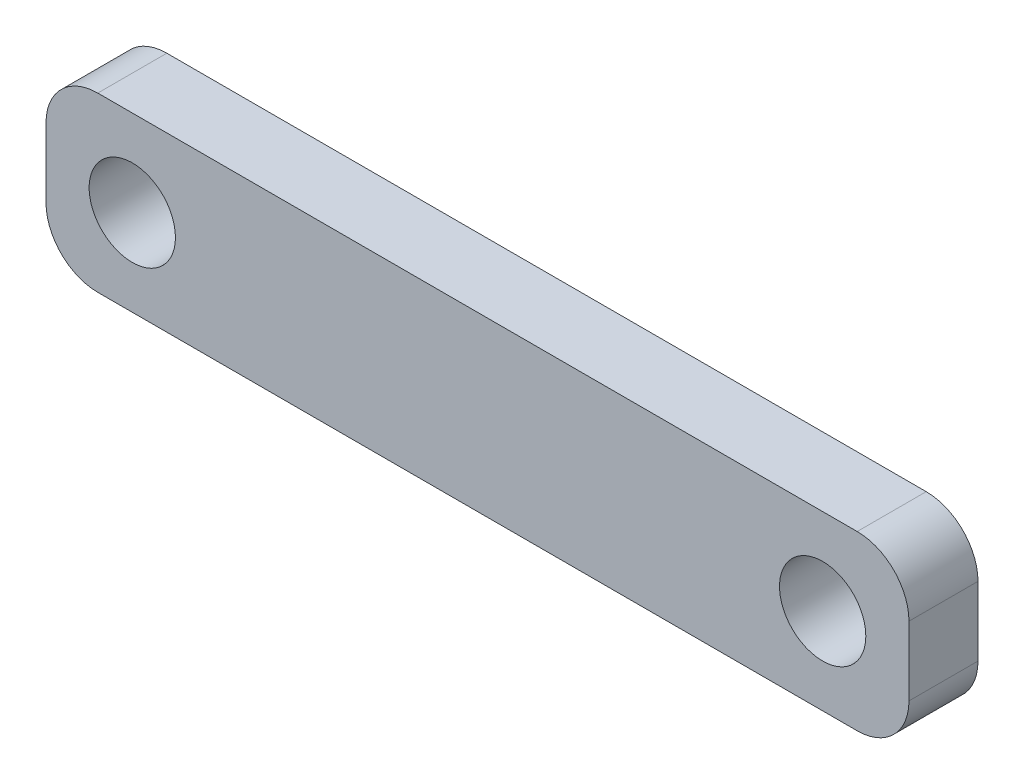
ISO-10303-21;
HEADER;
FILE_DESCRIPTION(('STEP AP214'),'2;1');
FILE_NAME('part.step','',(''),(''),'','','');
FILE_SCHEMA(('AUTOMOTIVE_DESIGN { 1 0 10303 214 1 1 1 1 }'));
ENDSEC;
DATA;
#1=APPLICATION_CONTEXT('core data for automotive mechanical design processes');
#2=APPLICATION_PROTOCOL_DEFINITION('international standard','automotive_design',2000,#1);
#3=PRODUCT_CONTEXT('',#1,'mechanical');
#4=PRODUCT('Part','Part','',(#3));
#5=PRODUCT_RELATED_PRODUCT_CATEGORY('part','',(#4));
#6=PRODUCT_DEFINITION_FORMATION('','',#4);
#7=PRODUCT_DEFINITION_CONTEXT('part definition',#1,'design');
#8=PRODUCT_DEFINITION('design','',#6,#7);
#9=PRODUCT_DEFINITION_SHAPE('','',#8);
#10=(LENGTH_UNIT() NAMED_UNIT(*) SI_UNIT(.MILLI.,.METRE.));
#11=(NAMED_UNIT(*) PLANE_ANGLE_UNIT() SI_UNIT($,.RADIAN.));
#12=(NAMED_UNIT(*) SI_UNIT($,.STERADIAN.) SOLID_ANGLE_UNIT());
#13=UNCERTAINTY_MEASURE_WITH_UNIT(LENGTH_MEASURE(1.E-05),#10,'distance_accuracy_value','');
#14=(GEOMETRIC_REPRESENTATION_CONTEXT(3) GLOBAL_UNCERTAINTY_ASSIGNED_CONTEXT((#13)) GLOBAL_UNIT_ASSIGNED_CONTEXT((#10,
#11,#12)) REPRESENTATION_CONTEXT('',''));
#15=CARTESIAN_POINT('',(0.,0.,0.));
#16=DIRECTION('',(0.,0.,1.));
#17=DIRECTION('',(1.,0.,0.));
#18=AXIS2_PLACEMENT_3D('',#15,#16,#17);
#19=CARTESIAN_POINT('',(0.,0.,4.));
#20=DIRECTION('',(0.,-1.,0.));
#21=DIRECTION('',(1.,0.,0.));
#22=AXIS2_PLACEMENT_3D('',#19,#20,#21);
#23=PLANE('',#22);
#24=DIRECTION('',(-1.,0.,0.));
#25=VECTOR('',#24,1.);
#26=CARTESIAN_POINT('',(0.,0.,4.));
#27=LINE('',#26,#25);
#28=CARTESIAN_POINT('',(-3.,0.,4.));
#29=VERTEX_POINT('',#28);
#30=CARTESIAN_POINT('',(-47.,0.,4.));
#31=VERTEX_POINT('',#30);
#32=EDGE_CURVE('E170',#29,#31,#27,.T.);
#33=ORIENTED_EDGE('',*,*,#32,.F.);
#34=DIRECTION('',(0.,0.,-1.));
#35=VECTOR('',#34,1.);
#36=CARTESIAN_POINT('',(-3.,0.,0.));
#37=LINE('',#36,#35);
#38=CARTESIAN_POINT('',(-3.,0.,0.));
#39=VERTEX_POINT('',#38);
#40=EDGE_CURVE('E149',#29,#39,#37,.T.);
#41=ORIENTED_EDGE('',*,*,#40,.T.);
#42=DIRECTION('',(-1.,0.,0.));
#43=VECTOR('',#42,1.);
#44=CARTESIAN_POINT('',(0.,0.,0.));
#45=LINE('',#44,#43);
#46=CARTESIAN_POINT('',(-47.,0.,0.));
#47=VERTEX_POINT('',#46);
#48=EDGE_CURVE('E103',#39,#47,#45,.T.);
#49=ORIENTED_EDGE('',*,*,#48,.T.);
#50=DIRECTION('',(0.,0.,-1.));
#51=VECTOR('',#50,1.);
#52=CARTESIAN_POINT('',(-47.,0.,4.));
#53=LINE('',#52,#51);
#54=EDGE_CURVE('E147',#47,#31,#53,.F.);
#55=ORIENTED_EDGE('',*,*,#54,.T.);
#56=EDGE_LOOP('',(#33,#41,#49,#55));
#57=FACE_BOUND('',#56,.T.);
#58=ADVANCED_FACE('F33',(#57),#23,.F.);
#59=CARTESIAN_POINT('',(-50.,0.,4.));
#60=DIRECTION('',(1.,0.,0.));
#61=DIRECTION('',(0.,0.,-1.));
#62=AXIS2_PLACEMENT_3D('',#59,#60,#61);
#63=PLANE('',#62);
#64=DIRECTION('',(0.,-1.,0.));
#65=VECTOR('',#64,1.);
#66=CARTESIAN_POINT('',(-50.,0.,0.));
#67=LINE('',#66,#65);
#68=CARTESIAN_POINT('',(-50.,-3.00000000000001,0.));
#69=VERTEX_POINT('',#68);
#70=CARTESIAN_POINT('',(-50.,-7.00000000000001,0.));
#71=VERTEX_POINT('',#70);
#72=EDGE_CURVE('E154',#69,#71,#67,.T.);
#73=ORIENTED_EDGE('',*,*,#72,.T.);
#74=DIRECTION('',(0.,0.,-1.));
#75=VECTOR('',#74,1.);
#76=CARTESIAN_POINT('',(-50.,-7.00000000000001,4.));
#77=LINE('',#76,#75);
#78=CARTESIAN_POINT('',(-50.,-7.00000000000001,4.));
#79=VERTEX_POINT('',#78);
#80=EDGE_CURVE('E11',#71,#79,#77,.F.);
#81=ORIENTED_EDGE('',*,*,#80,.T.);
#82=DIRECTION('',(0.,-1.,0.));
#83=VECTOR('',#82,1.);
#84=CARTESIAN_POINT('',(-50.,0.,4.));
#85=LINE('',#84,#83);
#86=CARTESIAN_POINT('',(-50.,-3.00000000000001,4.));
#87=VERTEX_POINT('',#86);
#88=EDGE_CURVE('E155',#87,#79,#85,.T.);
#89=ORIENTED_EDGE('',*,*,#88,.F.);
#90=DIRECTION('',(0.,0.,-1.));
#91=VECTOR('',#90,1.);
#92=CARTESIAN_POINT('',(-50.,-3.00000000000001,4.));
#93=LINE('',#92,#91);
#94=EDGE_CURVE('E41',#87,#69,#93,.T.);
#95=ORIENTED_EDGE('',*,*,#94,.T.);
#96=EDGE_LOOP('',(#73,#81,#89,#95));
#97=FACE_BOUND('',#96,.T.);
#98=ADVANCED_FACE('F153',(#97),#63,.F.);
#99=CARTESIAN_POINT('',(0.,-10.,4.));
#100=DIRECTION('',(0.,-1.,0.));
#101=DIRECTION('',(1.,0.,0.));
#102=AXIS2_PLACEMENT_3D('',#99,#100,#101);
#103=PLANE('',#102);
#104=DIRECTION('',(-1.,0.,0.));
#105=VECTOR('',#104,1.);
#106=CARTESIAN_POINT('',(0.,-10.,0.));
#107=LINE('',#106,#105);
#108=CARTESIAN_POINT('',(-3.,-10.,0.));
#109=VERTEX_POINT('',#108);
#110=CARTESIAN_POINT('',(-47.,-10.,0.));
#111=VERTEX_POINT('',#110);
#112=EDGE_CURVE('E120',#109,#111,#107,.T.);
#113=ORIENTED_EDGE('',*,*,#112,.F.);
#114=DIRECTION('',(0.,0.,-1.));
#115=VECTOR('',#114,1.);
#116=CARTESIAN_POINT('',(-3.,-10.,4.));
#117=LINE('',#116,#115);
#118=CARTESIAN_POINT('',(-3.,-10.,4.));
#119=VERTEX_POINT('',#118);
#120=EDGE_CURVE('E139',#109,#119,#117,.F.);
#121=ORIENTED_EDGE('',*,*,#120,.T.);
#122=DIRECTION('',(-1.,0.,0.));
#123=VECTOR('',#122,1.);
#124=CARTESIAN_POINT('',(0.,-10.,4.));
#125=LINE('',#124,#123);
#126=CARTESIAN_POINT('',(-47.,-10.,4.));
#127=VERTEX_POINT('',#126);
#128=EDGE_CURVE('E129',#119,#127,#125,.T.);
#129=ORIENTED_EDGE('',*,*,#128,.T.);
#130=DIRECTION('',(0.,0.,-1.));
#131=VECTOR('',#130,1.);
#132=CARTESIAN_POINT('',(-47.,-10.,0.));
#133=LINE('',#132,#131);
#134=EDGE_CURVE('E136',#127,#111,#133,.T.);
#135=ORIENTED_EDGE('',*,*,#134,.T.);
#136=EDGE_LOOP('',(#113,#121,#129,#135));
#137=FACE_BOUND('',#136,.T.);
#138=ADVANCED_FACE('F195',(#137),#103,.T.);
#139=CARTESIAN_POINT('',(-5.,-5.,4.));
#140=DIRECTION('',(0.,0.,-1.));
#141=DIRECTION('',(-1.,0.,0.));
#142=AXIS2_PLACEMENT_3D('',#139,#140,#141);
#143=CYLINDRICAL_SURFACE('',#142,2.5);
#144=CARTESIAN_POINT('',(-5.,-5.,4.));
#145=DIRECTION('',(0.,0.,1.));
#146=DIRECTION('',(1.,0.,0.));
#147=AXIS2_PLACEMENT_3D('',#144,#145,#146);
#148=CIRCLE('',#147,2.5);
#149=CARTESIAN_POINT('',(-2.5,-5.,4.));
#150=VERTEX_POINT('',#149);
#151=EDGE_CURVE('E172',#150,#150,#148,.T.);
#152=ORIENTED_EDGE('',*,*,#151,.T.);
#153=EDGE_LOOP('',(#152));
#154=FACE_BOUND('',#153,.T.);
#155=CARTESIAN_POINT('',(-5.,-5.,0.));
#156=DIRECTION('',(0.,0.,1.));
#157=DIRECTION('',(1.,0.,0.));
#158=AXIS2_PLACEMENT_3D('',#155,#156,#157);
#159=CIRCLE('',#158,2.5);
#160=CARTESIAN_POINT('',(-2.5,-5.,0.));
#161=VERTEX_POINT('',#160);
#162=EDGE_CURVE('E159',#161,#161,#159,.T.);
#163=ORIENTED_EDGE('',*,*,#162,.F.);
#164=EDGE_LOOP('',(#163));
#165=FACE_BOUND('',#164,.T.);
#166=ADVANCED_FACE('F214',(#154,#165),#143,.F.);
#167=CARTESIAN_POINT('',(-45.,-5.,4.));
#168=DIRECTION('',(0.,0.,-1.));
#169=DIRECTION('',(-1.,0.,0.));
#170=AXIS2_PLACEMENT_3D('',#167,#168,#169);
#171=CYLINDRICAL_SURFACE('',#170,2.5);
#172=CARTESIAN_POINT('',(-45.,-5.,4.));
#173=DIRECTION('',(0.,0.,1.));
#174=DIRECTION('',(1.,0.,0.));
#175=AXIS2_PLACEMENT_3D('',#172,#173,#174);
#176=CIRCLE('',#175,2.5);
#177=CARTESIAN_POINT('',(-42.5,-5.,4.));
#178=VERTEX_POINT('',#177);
#179=EDGE_CURVE('E119',#178,#178,#176,.T.);
#180=ORIENTED_EDGE('',*,*,#179,.T.);
#181=EDGE_LOOP('',(#180));
#182=FACE_BOUND('',#181,.T.);
#183=CARTESIAN_POINT('',(-45.,-5.,0.));
#184=DIRECTION('',(0.,0.,1.));
#185=DIRECTION('',(1.,0.,0.));
#186=AXIS2_PLACEMENT_3D('',#183,#184,#185);
#187=CIRCLE('',#186,2.5);
#188=CARTESIAN_POINT('',(-42.5,-5.,0.));
#189=VERTEX_POINT('',#188);
#190=EDGE_CURVE('E164',#189,#189,#187,.T.);
#191=ORIENTED_EDGE('',*,*,#190,.F.);
#192=EDGE_LOOP('',(#191));
#193=FACE_BOUND('',#192,.T.);
#194=ADVANCED_FACE('F178',(#182,#193),#171,.F.);
#195=CARTESIAN_POINT('',(0.,0.,4.));
#196=DIRECTION('',(1.,0.,0.));
#197=DIRECTION('',(0.,1.,0.));
#198=AXIS2_PLACEMENT_3D('',#195,#196,#197);
#199=PLANE('',#198);
#200=DIRECTION('',(0.,-1.,0.));
#201=VECTOR('',#200,1.);
#202=CARTESIAN_POINT('',(0.,0.,4.));
#203=LINE('',#202,#201);
#204=CARTESIAN_POINT('',(0.,-3.,4.));
#205=VERTEX_POINT('',#204);
#206=CARTESIAN_POINT('',(0.,-7.,4.));
#207=VERTEX_POINT('',#206);
#208=EDGE_CURVE('E125',#205,#207,#203,.T.);
#209=ORIENTED_EDGE('',*,*,#208,.T.);
#210=DIRECTION('',(0.,0.,-1.));
#211=VECTOR('',#210,1.);
#212=CARTESIAN_POINT('',(0.,-7.,4.));
#213=LINE('',#212,#211);
#214=CARTESIAN_POINT('',(0.,-7.,0.));
#215=VERTEX_POINT('',#214);
#216=EDGE_CURVE('E118',#207,#215,#213,.T.);
#217=ORIENTED_EDGE('',*,*,#216,.T.);
#218=DIRECTION('',(0.,-1.,0.));
#219=VECTOR('',#218,1.);
#220=CARTESIAN_POINT('',(0.,0.,0.));
#221=LINE('',#220,#219);
#222=CARTESIAN_POINT('',(0.,-3.,0.));
#223=VERTEX_POINT('',#222);
#224=EDGE_CURVE('E101',#223,#215,#221,.T.);
#225=ORIENTED_EDGE('',*,*,#224,.F.);
#226=DIRECTION('',(0.,0.,-1.));
#227=VECTOR('',#226,1.);
#228=CARTESIAN_POINT('',(0.,-3.,4.));
#229=LINE('',#228,#227);
#230=EDGE_CURVE('E115',#223,#205,#229,.F.);
#231=ORIENTED_EDGE('',*,*,#230,.T.);
#232=EDGE_LOOP('',(#209,#217,#225,#231));
#233=FACE_BOUND('',#232,.T.);
#234=ADVANCED_FACE('F114',(#233),#199,.T.);
#235=CARTESIAN_POINT('',(0.,0.,4.));
#236=DIRECTION('',(0.,0.,1.));
#237=DIRECTION('',(1.,0.,0.));
#238=AXIS2_PLACEMENT_3D('',#235,#236,#237);
#239=PLANE('',#238);
#240=ORIENTED_EDGE('',*,*,#179,.F.);
#241=EDGE_LOOP('',(#240));
#242=FACE_BOUND('',#241,.T.);
#243=ORIENTED_EDGE('',*,*,#151,.F.);
#244=EDGE_LOOP('',(#243));
#245=FACE_BOUND('',#244,.T.);
#246=ORIENTED_EDGE('',*,*,#128,.F.);
#247=CARTESIAN_POINT('',(-3.,-7.,4.));
#248=DIRECTION('',(0.,0.,1.));
#249=DIRECTION('',(1.,0.,0.));
#250=AXIS2_PLACEMENT_3D('',#247,#248,#249);
#251=CIRCLE('',#250,3.);
#252=EDGE_CURVE('E145',#119,#207,#251,.T.);
#253=ORIENTED_EDGE('',*,*,#252,.T.);
#254=ORIENTED_EDGE('',*,*,#208,.F.);
#255=CARTESIAN_POINT('',(-3.,-3.,4.));
#256=DIRECTION('',(0.,0.,1.));
#257=DIRECTION('',(1.,0.,0.));
#258=AXIS2_PLACEMENT_3D('',#255,#256,#257);
#259=CIRCLE('',#258,3.);
#260=EDGE_CURVE('E124',#205,#29,#259,.T.);
#261=ORIENTED_EDGE('',*,*,#260,.T.);
#262=ORIENTED_EDGE('',*,*,#32,.T.);
#263=CARTESIAN_POINT('',(-47.,-3.00000000000001,4.));
#264=DIRECTION('',(0.,0.,1.));
#265=DIRECTION('',(1.,0.,0.));
#266=AXIS2_PLACEMENT_3D('',#263,#264,#265);
#267=CIRCLE('',#266,3.);
#268=EDGE_CURVE('E53',#31,#87,#267,.T.);
#269=ORIENTED_EDGE('',*,*,#268,.T.);
#270=ORIENTED_EDGE('',*,*,#88,.T.);
#271=CARTESIAN_POINT('',(-47.,-7.00000000000001,4.));
#272=DIRECTION('',(0.,0.,1.));
#273=DIRECTION('',(1.,0.,0.));
#274=AXIS2_PLACEMENT_3D('',#271,#272,#273);
#275=CIRCLE('',#274,3.);
#276=EDGE_CURVE('E142',#79,#127,#275,.T.);
#277=ORIENTED_EDGE('',*,*,#276,.T.);
#278=EDGE_LOOP('',(#246,#253,#254,#261,#262,#269,#270,#277));
#279=FACE_BOUND('',#278,.T.);
#280=ADVANCED_FACE('F181',(#242,#245,#279),#239,.T.);
#281=CARTESIAN_POINT('',(0.,0.,0.));
#282=DIRECTION('',(0.,0.,1.));
#283=DIRECTION('',(1.,0.,0.));
#284=AXIS2_PLACEMENT_3D('',#281,#282,#283);
#285=PLANE('',#284);
#286=ORIENTED_EDGE('',*,*,#190,.T.);
#287=EDGE_LOOP('',(#286));
#288=FACE_BOUND('',#287,.T.);
#289=ORIENTED_EDGE('',*,*,#162,.T.);
#290=EDGE_LOOP('',(#289));
#291=FACE_BOUND('',#290,.T.);
#292=ORIENTED_EDGE('',*,*,#224,.T.);
#293=CARTESIAN_POINT('',(-3.,-7.,0.));
#294=DIRECTION('',(0.,0.,1.));
#295=DIRECTION('',(1.,0.,0.));
#296=AXIS2_PLACEMENT_3D('',#293,#294,#295);
#297=CIRCLE('',#296,3.);
#298=EDGE_CURVE('E108',#215,#109,#297,.F.);
#299=ORIENTED_EDGE('',*,*,#298,.T.);
#300=ORIENTED_EDGE('',*,*,#112,.T.);
#301=CARTESIAN_POINT('',(-47.,-7.00000000000001,0.));
#302=DIRECTION('',(0.,0.,1.));
#303=DIRECTION('',(1.,0.,0.));
#304=AXIS2_PLACEMENT_3D('',#301,#302,#303);
#305=CIRCLE('',#304,3.);
#306=EDGE_CURVE('E109',#111,#71,#305,.F.);
#307=ORIENTED_EDGE('',*,*,#306,.T.);
#308=ORIENTED_EDGE('',*,*,#72,.F.);
#309=CARTESIAN_POINT('',(-47.,-3.00000000000001,0.));
#310=DIRECTION('',(0.,0.,1.));
#311=DIRECTION('',(1.,0.,0.));
#312=AXIS2_PLACEMENT_3D('',#309,#310,#311);
#313=CIRCLE('',#312,3.);
#314=EDGE_CURVE('E127',#69,#47,#313,.F.);
#315=ORIENTED_EDGE('',*,*,#314,.T.);
#316=ORIENTED_EDGE('',*,*,#48,.F.);
#317=CARTESIAN_POINT('',(-3.,-3.,0.));
#318=DIRECTION('',(0.,0.,1.));
#319=DIRECTION('',(1.,0.,0.));
#320=AXIS2_PLACEMENT_3D('',#317,#318,#319);
#321=CIRCLE('',#320,3.);
#322=EDGE_CURVE('E98',#39,#223,#321,.F.);
#323=ORIENTED_EDGE('',*,*,#322,.T.);
#324=EDGE_LOOP('',(#292,#299,#300,#307,#308,#315,#316,#323));
#325=FACE_BOUND('',#324,.T.);
#326=ADVANCED_FACE('F100',(#288,#291,#325),#285,.F.);
#327=CARTESIAN_POINT('',(-3.,-7.,4.));
#328=DIRECTION('',(0.,0.,-1.));
#329=DIRECTION('',(-1.,0.,0.));
#330=AXIS2_PLACEMENT_3D('',#327,#328,#329);
#331=CYLINDRICAL_SURFACE('',#330,3.);
#332=ORIENTED_EDGE('',*,*,#252,.F.);
#333=ORIENTED_EDGE('',*,*,#120,.F.);
#334=ORIENTED_EDGE('',*,*,#298,.F.);
#335=ORIENTED_EDGE('',*,*,#216,.F.);
#336=EDGE_LOOP('',(#332,#333,#334,#335));
#337=FACE_BOUND('',#336,.T.);
#338=ADVANCED_FACE('F193',(#337),#331,.T.);
#339=CARTESIAN_POINT('',(-3.,-3.,4.));
#340=DIRECTION('',(0.,0.,1.));
#341=DIRECTION('',(1.,0.,0.));
#342=AXIS2_PLACEMENT_3D('',#339,#340,#341);
#343=CYLINDRICAL_SURFACE('',#342,3.);
#344=ORIENTED_EDGE('',*,*,#260,.F.);
#345=ORIENTED_EDGE('',*,*,#230,.F.);
#346=ORIENTED_EDGE('',*,*,#322,.F.);
#347=ORIENTED_EDGE('',*,*,#40,.F.);
#348=EDGE_LOOP('',(#344,#345,#346,#347));
#349=FACE_BOUND('',#348,.T.);
#350=ADVANCED_FACE('F123',(#349),#343,.T.);
#351=CARTESIAN_POINT('',(-47.,-7.00000000000001,4.));
#352=DIRECTION('',(0.,0.,1.));
#353=DIRECTION('',(1.,0.,0.));
#354=AXIS2_PLACEMENT_3D('',#351,#352,#353);
#355=CYLINDRICAL_SURFACE('',#354,3.);
#356=ORIENTED_EDGE('',*,*,#276,.F.);
#357=ORIENTED_EDGE('',*,*,#80,.F.);
#358=ORIENTED_EDGE('',*,*,#306,.F.);
#359=ORIENTED_EDGE('',*,*,#134,.F.);
#360=EDGE_LOOP('',(#356,#357,#358,#359));
#361=FACE_BOUND('',#360,.T.);
#362=ADVANCED_FACE('F197',(#361),#355,.T.);
#363=CARTESIAN_POINT('',(-47.,-3.00000000000001,4.));
#364=DIRECTION('',(0.,0.,-1.));
#365=DIRECTION('',(-1.,0.,0.));
#366=AXIS2_PLACEMENT_3D('',#363,#364,#365);
#367=CYLINDRICAL_SURFACE('',#366,3.);
#368=ORIENTED_EDGE('',*,*,#268,.F.);
#369=ORIENTED_EDGE('',*,*,#54,.F.);
#370=ORIENTED_EDGE('',*,*,#314,.F.);
#371=ORIENTED_EDGE('',*,*,#94,.F.);
#372=EDGE_LOOP('',(#368,#369,#370,#371));
#373=FACE_BOUND('',#372,.T.);
#374=ADVANCED_FACE('F35',(#373),#367,.T.);
#375=CLOSED_SHELL('',(#58,#98,#138,#166,#194,#234,#280,#326,#338,#350,#362,#374));
#376=MANIFOLD_SOLID_BREP('B2',#375);
#377=ADVANCED_BREP_SHAPE_REPRESENTATION('',(#18,#376),#14);
#378=SHAPE_DEFINITION_REPRESENTATION(#9,#377);
ENDSEC;
END-ISO-10303-21;
